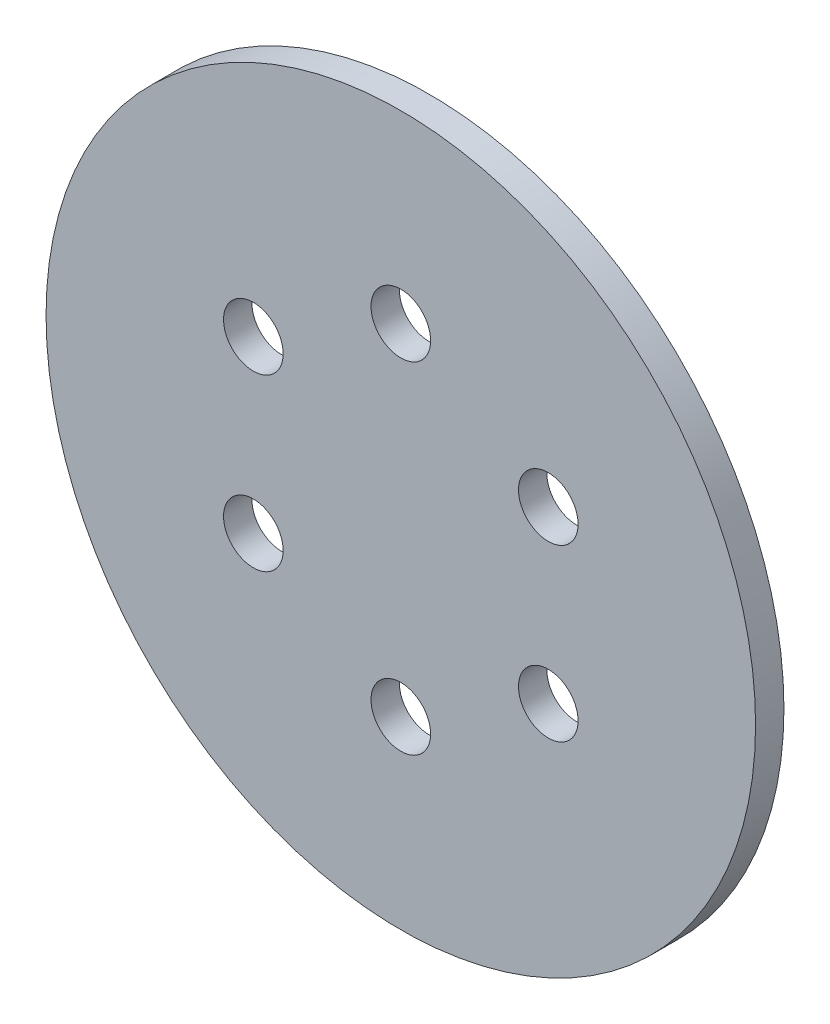
ISO-10303-21;
HEADER;
FILE_DESCRIPTION(('STEP AP214'),'2;1');
FILE_NAME('part.step','',(''),(''),'','','');
FILE_SCHEMA(('AUTOMOTIVE_DESIGN { 1 0 10303 214 1 1 1 1 }'));
ENDSEC;
DATA;
#1=APPLICATION_CONTEXT('core data for automotive mechanical design processes');
#2=APPLICATION_PROTOCOL_DEFINITION('international standard','automotive_design',2000,#1);
#3=PRODUCT_CONTEXT('',#1,'mechanical');
#4=PRODUCT('Part','Part','',(#3));
#5=PRODUCT_RELATED_PRODUCT_CATEGORY('part','',(#4));
#6=PRODUCT_DEFINITION_FORMATION('','',#4);
#7=PRODUCT_DEFINITION_CONTEXT('part definition',#1,'design');
#8=PRODUCT_DEFINITION('design','',#6,#7);
#9=PRODUCT_DEFINITION_SHAPE('','',#8);
#10=(LENGTH_UNIT() NAMED_UNIT(*) SI_UNIT(.MILLI.,.METRE.));
#11=(NAMED_UNIT(*) PLANE_ANGLE_UNIT() SI_UNIT($,.RADIAN.));
#12=(NAMED_UNIT(*) SI_UNIT($,.STERADIAN.) SOLID_ANGLE_UNIT());
#13=UNCERTAINTY_MEASURE_WITH_UNIT(LENGTH_MEASURE(1.E-05),#10,'distance_accuracy_value','');
#14=(GEOMETRIC_REPRESENTATION_CONTEXT(3) GLOBAL_UNCERTAINTY_ASSIGNED_CONTEXT((#13)) GLOBAL_UNIT_ASSIGNED_CONTEXT((#10,
#11,#12)) REPRESENTATION_CONTEXT('',''));
#15=CARTESIAN_POINT('',(0.,0.,0.));
#16=DIRECTION('',(0.,0.,1.));
#17=DIRECTION('',(1.,0.,0.));
#18=AXIS2_PLACEMENT_3D('',#15,#16,#17);
#19=CARTESIAN_POINT('',(0.,0.,2.));
#20=DIRECTION('',(0.,0.,1.));
#21=DIRECTION('',(1.,0.,0.));
#22=AXIS2_PLACEMENT_3D('',#19,#20,#21);
#23=PLANE('',#22);
#24=CARTESIAN_POINT('',(-10.3923048454133,-6.00000000000001,2.));
#25=DIRECTION('',(0.,0.,1.));
#26=DIRECTION('',(1.,0.,0.));
#27=AXIS2_PLACEMENT_3D('',#24,#25,#26);
#28=CIRCLE('',#27,2.1);
#29=CARTESIAN_POINT('',(-8.29230484541326,-6.00000000000001,2.));
#30=VERTEX_POINT('',#29);
#31=EDGE_CURVE('E76',#30,#30,#28,.T.);
#32=ORIENTED_EDGE('',*,*,#31,.F.);
#33=EDGE_LOOP('',(#32));
#34=FACE_BOUND('',#33,.T.);
#35=CARTESIAN_POINT('',(10.3923048454133,-6.,2.));
#36=DIRECTION('',(0.,0.,1.));
#37=DIRECTION('',(1.,0.,0.));
#38=AXIS2_PLACEMENT_3D('',#35,#36,#37);
#39=CIRCLE('',#38,2.1);
#40=CARTESIAN_POINT('',(12.4923048454133,-6.,2.));
#41=VERTEX_POINT('',#40);
#42=EDGE_CURVE('E62',#41,#41,#39,.T.);
#43=ORIENTED_EDGE('',*,*,#42,.F.);
#44=EDGE_LOOP('',(#43));
#45=FACE_BOUND('',#44,.T.);
#46=CARTESIAN_POINT('',(0.,12.,2.));
#47=DIRECTION('',(0.,0.,1.));
#48=DIRECTION('',(1.,0.,0.));
#49=AXIS2_PLACEMENT_3D('',#46,#47,#48);
#50=CIRCLE('',#49,2.1);
#51=CARTESIAN_POINT('',(2.1,12.,2.));
#52=VERTEX_POINT('',#51);
#53=EDGE_CURVE('E53',#52,#52,#50,.T.);
#54=ORIENTED_EDGE('',*,*,#53,.F.);
#55=EDGE_LOOP('',(#54));
#56=FACE_BOUND('',#55,.T.);
#57=CARTESIAN_POINT('',(0.,0.,2.));
#58=DIRECTION('',(0.,0.,1.));
#59=DIRECTION('',(1.,0.,0.));
#60=AXIS2_PLACEMENT_3D('',#57,#58,#59);
#61=CIRCLE('',#60,25.);
#62=CARTESIAN_POINT('',(25.,0.,2.));
#63=VERTEX_POINT('',#62);
#64=EDGE_CURVE('E10',#63,#63,#61,.T.);
#65=ORIENTED_EDGE('',*,*,#64,.T.);
#66=EDGE_LOOP('',(#65));
#67=FACE_BOUND('',#66,.T.);
#68=CARTESIAN_POINT('',(10.3923048454133,6.,2.));
#69=DIRECTION('',(0.,0.,1.));
#70=DIRECTION('',(1.,0.,0.));
#71=AXIS2_PLACEMENT_3D('',#68,#69,#70);
#72=CIRCLE('',#71,2.1);
#73=CARTESIAN_POINT('',(12.4923048454133,6.,2.));
#74=VERTEX_POINT('',#73);
#75=EDGE_CURVE('E56',#74,#74,#72,.T.);
#76=ORIENTED_EDGE('',*,*,#75,.F.);
#77=EDGE_LOOP('',(#76));
#78=FACE_BOUND('',#77,.T.);
#79=CARTESIAN_POINT('',(0.,-12.,2.));
#80=DIRECTION('',(0.,0.,1.));
#81=DIRECTION('',(1.,0.,0.));
#82=AXIS2_PLACEMENT_3D('',#79,#80,#81);
#83=CIRCLE('',#82,2.1);
#84=CARTESIAN_POINT('',(2.1,-12.,2.));
#85=VERTEX_POINT('',#84);
#86=EDGE_CURVE('E72',#85,#85,#83,.T.);
#87=ORIENTED_EDGE('',*,*,#86,.F.);
#88=EDGE_LOOP('',(#87));
#89=FACE_BOUND('',#88,.T.);
#90=CARTESIAN_POINT('',(-10.3923048454133,5.99999999999999,2.));
#91=DIRECTION('',(0.,0.,1.));
#92=DIRECTION('',(1.,0.,0.));
#93=AXIS2_PLACEMENT_3D('',#90,#91,#92);
#94=CIRCLE('',#93,2.1);
#95=CARTESIAN_POINT('',(-8.29230484541327,5.99999999999999,2.));
#96=VERTEX_POINT('',#95);
#97=EDGE_CURVE('E81',#96,#96,#94,.T.);
#98=ORIENTED_EDGE('',*,*,#97,.F.);
#99=EDGE_LOOP('',(#98));
#100=FACE_BOUND('',#99,.T.);
#101=ADVANCED_FACE('F43',(#34,#45,#56,#67,#78,#89,#100),#23,.T.);
#102=CARTESIAN_POINT('',(0.,0.,0.));
#103=DIRECTION('',(0.,0.,1.));
#104=DIRECTION('',(1.,0.,0.));
#105=AXIS2_PLACEMENT_3D('',#102,#103,#104);
#106=PLANE('',#105);
#107=CARTESIAN_POINT('',(0.,0.,0.));
#108=DIRECTION('',(0.,0.,1.));
#109=DIRECTION('',(1.,0.,0.));
#110=AXIS2_PLACEMENT_3D('',#107,#108,#109);
#111=CIRCLE('',#110,25.);
#112=CARTESIAN_POINT('',(25.,0.,0.));
#113=VERTEX_POINT('',#112);
#114=EDGE_CURVE('E50',#113,#113,#111,.T.);
#115=ORIENTED_EDGE('',*,*,#114,.F.);
#116=EDGE_LOOP('',(#115));
#117=FACE_BOUND('',#116,.T.);
#118=CARTESIAN_POINT('',(0.,12.,0.));
#119=DIRECTION('',(0.,0.,1.));
#120=DIRECTION('',(1.,0.,0.));
#121=AXIS2_PLACEMENT_3D('',#118,#119,#120);
#122=CIRCLE('',#121,2.1);
#123=CARTESIAN_POINT('',(2.1,12.,0.));
#124=VERTEX_POINT('',#123);
#125=EDGE_CURVE('E57',#124,#124,#122,.T.);
#126=ORIENTED_EDGE('',*,*,#125,.T.);
#127=EDGE_LOOP('',(#126));
#128=FACE_BOUND('',#127,.T.);
#129=CARTESIAN_POINT('',(10.3923048454133,6.,0.));
#130=DIRECTION('',(0.,0.,1.));
#131=DIRECTION('',(1.,0.,0.));
#132=AXIS2_PLACEMENT_3D('',#129,#130,#131);
#133=CIRCLE('',#132,2.1);
#134=CARTESIAN_POINT('',(12.4923048454133,6.,0.));
#135=VERTEX_POINT('',#134);
#136=EDGE_CURVE('E61',#135,#135,#133,.T.);
#137=ORIENTED_EDGE('',*,*,#136,.T.);
#138=EDGE_LOOP('',(#137));
#139=FACE_BOUND('',#138,.T.);
#140=CARTESIAN_POINT('',(10.3923048454133,-6.,0.));
#141=DIRECTION('',(0.,0.,1.));
#142=DIRECTION('',(1.,0.,0.));
#143=AXIS2_PLACEMENT_3D('',#140,#141,#142);
#144=CIRCLE('',#143,2.1);
#145=CARTESIAN_POINT('',(12.4923048454133,-6.,0.));
#146=VERTEX_POINT('',#145);
#147=EDGE_CURVE('E66',#146,#146,#144,.T.);
#148=ORIENTED_EDGE('',*,*,#147,.T.);
#149=EDGE_LOOP('',(#148));
#150=FACE_BOUND('',#149,.T.);
#151=CARTESIAN_POINT('',(0.,-12.,0.));
#152=DIRECTION('',(0.,0.,1.));
#153=DIRECTION('',(1.,0.,0.));
#154=AXIS2_PLACEMENT_3D('',#151,#152,#153);
#155=CIRCLE('',#154,2.1);
#156=CARTESIAN_POINT('',(2.1,-12.,0.));
#157=VERTEX_POINT('',#156);
#158=EDGE_CURVE('E74',#157,#157,#155,.T.);
#159=ORIENTED_EDGE('',*,*,#158,.T.);
#160=EDGE_LOOP('',(#159));
#161=FACE_BOUND('',#160,.T.);
#162=CARTESIAN_POINT('',(-10.3923048454133,-6.00000000000001,0.));
#163=DIRECTION('',(0.,0.,1.));
#164=DIRECTION('',(1.,0.,0.));
#165=AXIS2_PLACEMENT_3D('',#162,#163,#164);
#166=CIRCLE('',#165,2.1);
#167=CARTESIAN_POINT('',(-8.29230484541326,-6.00000000000001,0.));
#168=VERTEX_POINT('',#167);
#169=EDGE_CURVE('E77',#168,#168,#166,.T.);
#170=ORIENTED_EDGE('',*,*,#169,.T.);
#171=EDGE_LOOP('',(#170));
#172=FACE_BOUND('',#171,.T.);
#173=CARTESIAN_POINT('',(-10.3923048454133,5.99999999999999,0.));
#174=DIRECTION('',(0.,0.,1.));
#175=DIRECTION('',(1.,0.,0.));
#176=AXIS2_PLACEMENT_3D('',#173,#174,#175);
#177=CIRCLE('',#176,2.1);
#178=CARTESIAN_POINT('',(-8.29230484541327,5.99999999999999,0.));
#179=VERTEX_POINT('',#178);
#180=EDGE_CURVE('E88',#179,#179,#177,.T.);
#181=ORIENTED_EDGE('',*,*,#180,.T.);
#182=EDGE_LOOP('',(#181));
#183=FACE_BOUND('',#182,.T.);
#184=ADVANCED_FACE('F96',(#117,#128,#139,#150,#161,#172,#183),#106,.F.);
#185=CARTESIAN_POINT('',(0.,0.,2.));
#186=DIRECTION('',(0.,0.,-1.));
#187=DIRECTION('',(-1.,0.,0.));
#188=AXIS2_PLACEMENT_3D('',#185,#186,#187);
#189=CYLINDRICAL_SURFACE('',#188,25.);
#190=ORIENTED_EDGE('',*,*,#64,.F.);
#191=EDGE_LOOP('',(#190));
#192=FACE_BOUND('',#191,.T.);
#193=ORIENTED_EDGE('',*,*,#114,.T.);
#194=EDGE_LOOP('',(#193));
#195=FACE_BOUND('',#194,.T.);
#196=ADVANCED_FACE('F44',(#192,#195),#189,.T.);
#197=CARTESIAN_POINT('',(0.,12.,2.));
#198=DIRECTION('',(0.,0.,-1.));
#199=DIRECTION('',(-1.,0.,0.));
#200=AXIS2_PLACEMENT_3D('',#197,#198,#199);
#201=CYLINDRICAL_SURFACE('',#200,2.1);
#202=ORIENTED_EDGE('',*,*,#53,.T.);
#203=EDGE_LOOP('',(#202));
#204=FACE_BOUND('',#203,.T.);
#205=ORIENTED_EDGE('',*,*,#125,.F.);
#206=EDGE_LOOP('',(#205));
#207=FACE_BOUND('',#206,.T.);
#208=ADVANCED_FACE('F106',(#204,#207),#201,.F.);
#209=CARTESIAN_POINT('',(10.3923048454133,6.,2.));
#210=DIRECTION('',(0.,0.,-1.));
#211=DIRECTION('',(-1.,0.,0.));
#212=AXIS2_PLACEMENT_3D('',#209,#210,#211);
#213=CYLINDRICAL_SURFACE('',#212,2.1);
#214=ORIENTED_EDGE('',*,*,#75,.T.);
#215=EDGE_LOOP('',(#214));
#216=FACE_BOUND('',#215,.T.);
#217=ORIENTED_EDGE('',*,*,#136,.F.);
#218=EDGE_LOOP('',(#217));
#219=FACE_BOUND('',#218,.T.);
#220=ADVANCED_FACE('F108',(#216,#219),#213,.F.);
#221=CARTESIAN_POINT('',(10.3923048454133,-6.,2.));
#222=DIRECTION('',(0.,0.,-1.));
#223=DIRECTION('',(-1.,0.,0.));
#224=AXIS2_PLACEMENT_3D('',#221,#222,#223);
#225=CYLINDRICAL_SURFACE('',#224,2.1);
#226=ORIENTED_EDGE('',*,*,#42,.T.);
#227=EDGE_LOOP('',(#226));
#228=FACE_BOUND('',#227,.T.);
#229=ORIENTED_EDGE('',*,*,#147,.F.);
#230=EDGE_LOOP('',(#229));
#231=FACE_BOUND('',#230,.T.);
#232=ADVANCED_FACE('F114',(#228,#231),#225,.F.);
#233=CARTESIAN_POINT('',(0.,-12.,2.));
#234=DIRECTION('',(0.,0.,-1.));
#235=DIRECTION('',(-1.,0.,0.));
#236=AXIS2_PLACEMENT_3D('',#233,#234,#235);
#237=CYLINDRICAL_SURFACE('',#236,2.1);
#238=ORIENTED_EDGE('',*,*,#86,.T.);
#239=EDGE_LOOP('',(#238));
#240=FACE_BOUND('',#239,.T.);
#241=ORIENTED_EDGE('',*,*,#158,.F.);
#242=EDGE_LOOP('',(#241));
#243=FACE_BOUND('',#242,.T.);
#244=ADVANCED_FACE('F116',(#240,#243),#237,.F.);
#245=CARTESIAN_POINT('',(-10.3923048454133,-6.00000000000001,2.));
#246=DIRECTION('',(0.,0.,-1.));
#247=DIRECTION('',(-1.,0.,0.));
#248=AXIS2_PLACEMENT_3D('',#245,#246,#247);
#249=CYLINDRICAL_SURFACE('',#248,2.1);
#250=ORIENTED_EDGE('',*,*,#31,.T.);
#251=EDGE_LOOP('',(#250));
#252=FACE_BOUND('',#251,.T.);
#253=ORIENTED_EDGE('',*,*,#169,.F.);
#254=EDGE_LOOP('',(#253));
#255=FACE_BOUND('',#254,.T.);
#256=ADVANCED_FACE('F123',(#252,#255),#249,.F.);
#257=CARTESIAN_POINT('',(-10.3923048454133,5.99999999999999,2.));
#258=DIRECTION('',(0.,0.,-1.));
#259=DIRECTION('',(-1.,0.,0.));
#260=AXIS2_PLACEMENT_3D('',#257,#258,#259);
#261=CYLINDRICAL_SURFACE('',#260,2.1);
#262=ORIENTED_EDGE('',*,*,#97,.T.);
#263=EDGE_LOOP('',(#262));
#264=FACE_BOUND('',#263,.T.);
#265=ORIENTED_EDGE('',*,*,#180,.F.);
#266=EDGE_LOOP('',(#265));
#267=FACE_BOUND('',#266,.T.);
#268=ADVANCED_FACE('F95',(#264,#267),#261,.F.);
#269=CLOSED_SHELL('',(#101,#184,#196,#208,#220,#232,#244,#256,#268));
#270=MANIFOLD_SOLID_BREP('B2',#269);
#271=ADVANCED_BREP_SHAPE_REPRESENTATION('',(#18,#270),#14);
#272=SHAPE_DEFINITION_REPRESENTATION(#9,#271);
ENDSEC;
END-ISO-10303-21;
